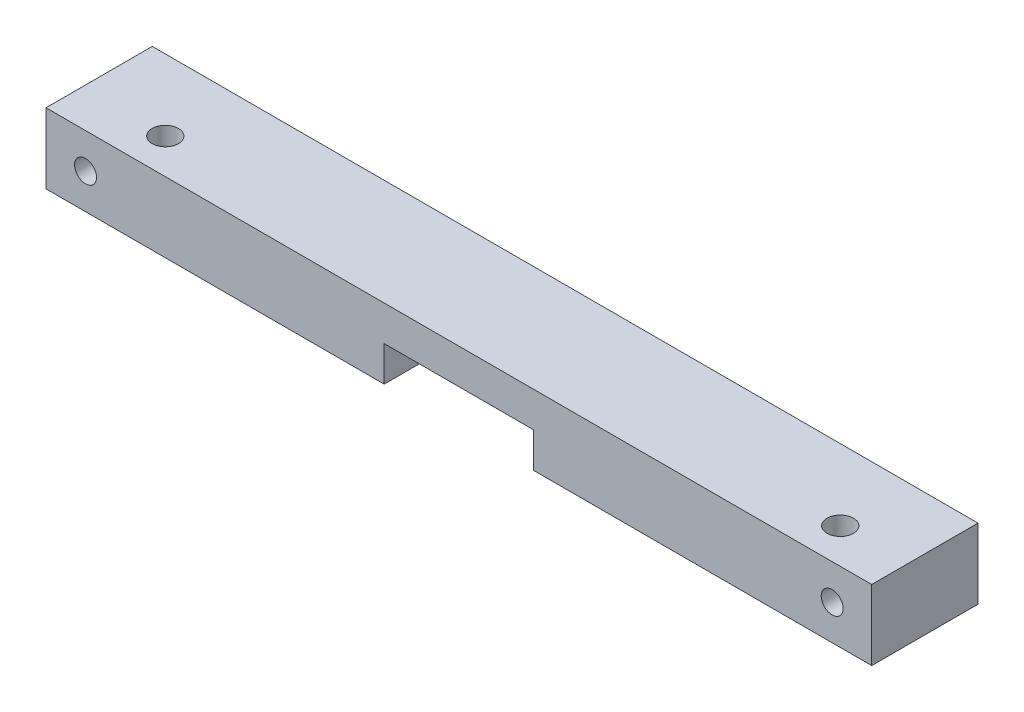
ISO-10303-21;
HEADER;
FILE_DESCRIPTION(('STEP AP214'),'2;1');
FILE_NAME('part.step','',(''),(''),'','','');
FILE_SCHEMA(('AUTOMOTIVE_DESIGN { 1 0 10303 214 1 1 1 1 }'));
ENDSEC;
DATA;
#1=APPLICATION_CONTEXT('core data for automotive mechanical design processes');
#2=APPLICATION_PROTOCOL_DEFINITION('international standard','automotive_design',2000,#1);
#3=PRODUCT_CONTEXT('',#1,'mechanical');
#4=PRODUCT('Part','Part','',(#3));
#5=PRODUCT_RELATED_PRODUCT_CATEGORY('part','',(#4));
#6=PRODUCT_DEFINITION_FORMATION('','',#4);
#7=PRODUCT_DEFINITION_CONTEXT('part definition',#1,'design');
#8=PRODUCT_DEFINITION('design','',#6,#7);
#9=PRODUCT_DEFINITION_SHAPE('','',#8);
#10=(LENGTH_UNIT() NAMED_UNIT(*) SI_UNIT(.MILLI.,.METRE.));
#11=(NAMED_UNIT(*) PLANE_ANGLE_UNIT() SI_UNIT($,.RADIAN.));
#12=(NAMED_UNIT(*) SI_UNIT($,.STERADIAN.) SOLID_ANGLE_UNIT());
#13=UNCERTAINTY_MEASURE_WITH_UNIT(LENGTH_MEASURE(1.E-05),#10,'distance_accuracy_value','');
#14=(GEOMETRIC_REPRESENTATION_CONTEXT(3) GLOBAL_UNCERTAINTY_ASSIGNED_CONTEXT((#13)) GLOBAL_UNIT_ASSIGNED_CONTEXT((#10,
#11,#12)) REPRESENTATION_CONTEXT('',''));
#15=CARTESIAN_POINT('',(0.,0.,0.));
#16=DIRECTION('',(0.,0.,1.));
#17=DIRECTION('',(1.,0.,0.));
#18=AXIS2_PLACEMENT_3D('',#15,#16,#17);
#19=CARTESIAN_POINT('',(298.45,0.,0.));
#20=DIRECTION('',(0.,1.,0.));
#21=DIRECTION('',(0.,0.,1.));
#22=AXIS2_PLACEMENT_3D('',#19,#20,#21);
#23=PLANE('',#22);
#24=CARTESIAN_POINT('',(30.4121566,0.,-12.7));
#25=DIRECTION('',(0.,1.,0.));
#26=DIRECTION('',(0.,0.,1.));
#27=AXIS2_PLACEMENT_3D('',#24,#25,#26);
#28=CIRCLE('',#27,4.7625);
#29=CARTESIAN_POINT('',(30.4121566,0.,-7.9375));
#30=VERTEX_POINT('',#29);
#31=EDGE_CURVE('E152',#30,#30,#28,.T.);
#32=ORIENTED_EDGE('',*,*,#31,.T.);
#33=EDGE_LOOP('',(#32));
#34=FACE_BOUND('',#33,.T.);
#35=DIRECTION('',(-1.,0.,0.));
#36=VECTOR('',#35,1.);
#37=CARTESIAN_POINT('',(298.45,0.,-38.421818));
#38=LINE('',#37,#36);
#39=CARTESIAN_POINT('',(122.2375,0.,-38.421818));
#40=VERTEX_POINT('',#39);
#41=CARTESIAN_POINT('',(0.,0.,-38.421818));
#42=VERTEX_POINT('',#41);
#43=EDGE_CURVE('E191',#40,#42,#38,.T.);
#44=ORIENTED_EDGE('',*,*,#43,.F.);
#45=DIRECTION('',(0.,0.,-1.));
#46=VECTOR('',#45,1.);
#47=CARTESIAN_POINT('',(122.2375,0.,0.));
#48=LINE('',#47,#46);
#49=CARTESIAN_POINT('',(122.2375,0.,0.));
#50=VERTEX_POINT('',#49);
#51=EDGE_CURVE('E118',#50,#40,#48,.T.);
#52=ORIENTED_EDGE('',*,*,#51,.F.);
#53=DIRECTION('',(-1.,0.,0.));
#54=VECTOR('',#53,1.);
#55=CARTESIAN_POINT('',(298.45,0.,0.));
#56=LINE('',#55,#54);
#57=CARTESIAN_POINT('',(0.,0.,0.));
#58=VERTEX_POINT('',#57);
#59=EDGE_CURVE('E47',#50,#58,#56,.T.);
#60=ORIENTED_EDGE('',*,*,#59,.T.);
#61=DIRECTION('',(0.,0.,-1.));
#62=VECTOR('',#61,1.);
#63=CARTESIAN_POINT('',(0.,0.,0.));
#64=LINE('',#63,#62);
#65=EDGE_CURVE('E183',#58,#42,#64,.T.);
#66=ORIENTED_EDGE('',*,*,#65,.T.);
#67=EDGE_LOOP('',(#44,#52,#60,#66));
#68=FACE_BOUND('',#67,.T.);
#69=ADVANCED_FACE('F39',(#34,#68),#23,.F.);
#70=CARTESIAN_POINT('',(298.45,0.,-38.421818));
#71=DIRECTION('',(0.,0.,1.));
#72=DIRECTION('',(1.,0.,0.));
#73=AXIS2_PLACEMENT_3D('',#70,#71,#72);
#74=PLANE('',#73);
#75=CARTESIAN_POINT('',(14.2875,12.7,-38.421818));
#76=DIRECTION('',(0.,0.,-1.));
#77=DIRECTION('',(-1.,0.,0.));
#78=AXIS2_PLACEMENT_3D('',#75,#76,#77);
#79=CIRCLE('',#78,3.96875);
#80=CARTESIAN_POINT('',(10.31875,12.7,-38.421818));
#81=VERTEX_POINT('',#80);
#82=EDGE_CURVE('E167',#81,#81,#79,.T.);
#83=ORIENTED_EDGE('',*,*,#82,.F.);
#84=EDGE_LOOP('',(#83));
#85=FACE_BOUND('',#84,.T.);
#86=DIRECTION('',(1.,0.,0.));
#87=VECTOR('',#86,1.);
#88=CARTESIAN_POINT('',(122.2375,12.7,-38.421818));
#89=LINE('',#88,#87);
#90=CARTESIAN_POINT('',(122.2375,12.7,-38.421818));
#91=VERTEX_POINT('',#90);
#92=CARTESIAN_POINT('',(176.2125,12.7,-38.421818));
#93=VERTEX_POINT('',#92);
#94=EDGE_CURVE('E128',#91,#93,#89,.T.);
#95=ORIENTED_EDGE('',*,*,#94,.F.);
#96=DIRECTION('',(0.,-1.,0.));
#97=VECTOR('',#96,1.);
#98=CARTESIAN_POINT('',(122.2375,12.7,-38.421818));
#99=LINE('',#98,#97);
#100=EDGE_CURVE('E112',#91,#40,#99,.T.);
#101=ORIENTED_EDGE('',*,*,#100,.T.);
#102=ORIENTED_EDGE('',*,*,#43,.T.);
#103=DIRECTION('',(0.,1.,0.));
#104=VECTOR('',#103,1.);
#105=CARTESIAN_POINT('',(0.,0.,-38.421818));
#106=LINE('',#105,#104);
#107=CARTESIAN_POINT('',(0.,25.4,-38.421818));
#108=VERTEX_POINT('',#107);
#109=EDGE_CURVE('E186',#42,#108,#106,.T.);
#110=ORIENTED_EDGE('',*,*,#109,.T.);
#111=DIRECTION('',(-1.,0.,0.));
#112=VECTOR('',#111,1.);
#113=CARTESIAN_POINT('',(298.45,25.4,-38.421818));
#114=LINE('',#113,#112);
#115=CARTESIAN_POINT('',(298.45,25.4,-38.421818));
#116=VERTEX_POINT('',#115);
#117=EDGE_CURVE('E190',#116,#108,#114,.T.);
#118=ORIENTED_EDGE('',*,*,#117,.F.);
#119=DIRECTION('',(0.,1.,0.));
#120=VECTOR('',#119,1.);
#121=CARTESIAN_POINT('',(298.45,0.,-38.421818));
#122=LINE('',#121,#120);
#123=CARTESIAN_POINT('',(298.45,0.,-38.421818));
#124=VERTEX_POINT('',#123);
#125=EDGE_CURVE('E177',#124,#116,#122,.T.);
#126=ORIENTED_EDGE('',*,*,#125,.F.);
#127=CARTESIAN_POINT('',(176.2125,0.,-38.421818));
#128=VERTEX_POINT('',#127);
#129=EDGE_CURVE('E192',#124,#128,#38,.T.);
#130=ORIENTED_EDGE('',*,*,#129,.T.);
#131=DIRECTION('',(0.,-1.,0.));
#132=VECTOR('',#131,1.);
#133=CARTESIAN_POINT('',(176.2125,12.7,-38.421818));
#134=LINE('',#133,#132);
#135=EDGE_CURVE('E54',#93,#128,#134,.T.);
#136=ORIENTED_EDGE('',*,*,#135,.F.);
#137=EDGE_LOOP('',(#95,#101,#102,#110,#118,#126,#130,#136));
#138=FACE_BOUND('',#137,.T.);
#139=CARTESIAN_POINT('',(284.1625,12.7,-38.421818));
#140=DIRECTION('',(0.,0.,-1.));
#141=DIRECTION('',(-1.,0.,0.));
#142=AXIS2_PLACEMENT_3D('',#139,#140,#141);
#143=CIRCLE('',#142,3.96875000000002);
#144=CARTESIAN_POINT('',(280.19375,12.7,-38.421818));
#145=VERTEX_POINT('',#144);
#146=EDGE_CURVE('E161',#145,#145,#143,.T.);
#147=ORIENTED_EDGE('',*,*,#146,.F.);
#148=EDGE_LOOP('',(#147));
#149=FACE_BOUND('',#148,.T.);
#150=ADVANCED_FACE('F133',(#85,#138,#149),#74,.F.);
#151=CARTESIAN_POINT('',(298.45,0.,0.));
#152=DIRECTION('',(0.,0.,-1.));
#153=DIRECTION('',(-1.,0.,0.));
#154=AXIS2_PLACEMENT_3D('',#151,#152,#153);
#155=PLANE('',#154);
#156=ORIENTED_EDGE('',*,*,#59,.F.);
#157=DIRECTION('',(0.,-1.,0.));
#158=VECTOR('',#157,1.);
#159=CARTESIAN_POINT('',(122.2375,12.7,0.));
#160=LINE('',#159,#158);
#161=CARTESIAN_POINT('',(122.2375,12.7,0.));
#162=VERTEX_POINT('',#161);
#163=EDGE_CURVE('E143',#162,#50,#160,.T.);
#164=ORIENTED_EDGE('',*,*,#163,.F.);
#165=DIRECTION('',(-1.,0.,0.));
#166=VECTOR('',#165,1.);
#167=CARTESIAN_POINT('',(122.2375,12.7,0.));
#168=LINE('',#167,#166);
#169=CARTESIAN_POINT('',(176.2125,12.7,0.));
#170=VERTEX_POINT('',#169);
#171=EDGE_CURVE('E122',#170,#162,#168,.T.);
#172=ORIENTED_EDGE('',*,*,#171,.F.);
#173=DIRECTION('',(0.,-1.,0.));
#174=VECTOR('',#173,1.);
#175=CARTESIAN_POINT('',(176.2125,12.7,0.));
#176=LINE('',#175,#174);
#177=CARTESIAN_POINT('',(176.2125,0.,0.));
#178=VERTEX_POINT('',#177);
#179=EDGE_CURVE('E146',#170,#178,#176,.T.);
#180=ORIENTED_EDGE('',*,*,#179,.T.);
#181=CARTESIAN_POINT('',(298.45,0.,0.));
#182=VERTEX_POINT('',#181);
#183=EDGE_CURVE('E11',#182,#178,#56,.T.);
#184=ORIENTED_EDGE('',*,*,#183,.F.);
#185=DIRECTION('',(0.,-1.,0.));
#186=VECTOR('',#185,1.);
#187=CARTESIAN_POINT('',(298.45,0.,0.));
#188=LINE('',#187,#186);
#189=CARTESIAN_POINT('',(298.45,25.4,0.));
#190=VERTEX_POINT('',#189);
#191=EDGE_CURVE('E174',#190,#182,#188,.T.);
#192=ORIENTED_EDGE('',*,*,#191,.F.);
#193=DIRECTION('',(-1.,0.,0.));
#194=VECTOR('',#193,1.);
#195=CARTESIAN_POINT('',(298.45,25.4,0.));
#196=LINE('',#195,#194);
#197=CARTESIAN_POINT('',(0.,25.4,0.));
#198=VERTEX_POINT('',#197);
#199=EDGE_CURVE('E180',#190,#198,#196,.T.);
#200=ORIENTED_EDGE('',*,*,#199,.T.);
#201=DIRECTION('',(0.,-1.,0.));
#202=VECTOR('',#201,1.);
#203=CARTESIAN_POINT('',(0.,0.,0.));
#204=LINE('',#203,#202);
#205=EDGE_CURVE('E173',#198,#58,#204,.T.);
#206=ORIENTED_EDGE('',*,*,#205,.T.);
#207=EDGE_LOOP('',(#156,#164,#172,#180,#184,#192,#200,#206));
#208=FACE_BOUND('',#207,.T.);
#209=CARTESIAN_POINT('',(284.1625,12.7,0.));
#210=DIRECTION('',(0.,0.,-1.));
#211=DIRECTION('',(-1.,0.,0.));
#212=AXIS2_PLACEMENT_3D('',#209,#210,#211);
#213=CIRCLE('',#212,3.96874999999997);
#214=CARTESIAN_POINT('',(280.19375,12.7,0.));
#215=VERTEX_POINT('',#214);
#216=EDGE_CURVE('E164',#215,#215,#213,.T.);
#217=ORIENTED_EDGE('',*,*,#216,.T.);
#218=EDGE_LOOP('',(#217));
#219=FACE_BOUND('',#218,.T.);
#220=CARTESIAN_POINT('',(14.2875,12.7,0.));
#221=DIRECTION('',(0.,0.,-1.));
#222=DIRECTION('',(-1.,0.,0.));
#223=AXIS2_PLACEMENT_3D('',#220,#221,#222);
#224=CIRCLE('',#223,3.96874999999999);
#225=CARTESIAN_POINT('',(10.31875,12.7,0.));
#226=VERTEX_POINT('',#225);
#227=EDGE_CURVE('E170',#226,#226,#224,.T.);
#228=ORIENTED_EDGE('',*,*,#227,.T.);
#229=EDGE_LOOP('',(#228));
#230=FACE_BOUND('',#229,.T.);
#231=ADVANCED_FACE('F41',(#208,#219,#230),#155,.F.);
#232=CARTESIAN_POINT('',(274.3878434,0.,-12.7));
#233=DIRECTION('',(0.,1.,0.));
#234=DIRECTION('',(0.,0.,1.));
#235=AXIS2_PLACEMENT_3D('',#232,#233,#234);
#236=CIRCLE('',#235,4.7625);
#237=CARTESIAN_POINT('',(274.3878434,0.,-7.9375));
#238=VERTEX_POINT('',#237);
#239=EDGE_CURVE('E158',#238,#238,#236,.T.);
#240=ORIENTED_EDGE('',*,*,#239,.T.);
#241=EDGE_LOOP('',(#240));
#242=FACE_BOUND('',#241,.T.);
#243=ORIENTED_EDGE('',*,*,#183,.T.);
#244=DIRECTION('',(0.,0.,1.));
#245=VECTOR('',#244,1.);
#246=CARTESIAN_POINT('',(176.2125,0.,0.));
#247=LINE('',#246,#245);
#248=EDGE_CURVE('E131',#128,#178,#247,.T.);
#249=ORIENTED_EDGE('',*,*,#248,.F.);
#250=ORIENTED_EDGE('',*,*,#129,.F.);
#251=DIRECTION('',(0.,0.,-1.));
#252=VECTOR('',#251,1.);
#253=CARTESIAN_POINT('',(298.45,0.,0.));
#254=LINE('',#253,#252);
#255=EDGE_CURVE('E91',#182,#124,#254,.T.);
#256=ORIENTED_EDGE('',*,*,#255,.F.);
#257=EDGE_LOOP('',(#243,#249,#250,#256));
#258=FACE_BOUND('',#257,.T.);
#259=ADVANCED_FACE('F208',(#242,#258),#23,.F.);
#260=CARTESIAN_POINT('',(298.45,25.4,0.));
#261=DIRECTION('',(0.,-1.,0.));
#262=DIRECTION('',(0.,0.,-1.));
#263=AXIS2_PLACEMENT_3D('',#260,#261,#262);
#264=PLANE('',#263);
#265=CARTESIAN_POINT('',(30.4121566,25.4,-12.7));
#266=DIRECTION('',(0.,1.,0.));
#267=DIRECTION('',(0.,0.,1.));
#268=AXIS2_PLACEMENT_3D('',#265,#266,#267);
#269=CIRCLE('',#268,4.76249999999999);
#270=CARTESIAN_POINT('',(30.4121566,25.4,-7.93750000000001));
#271=VERTEX_POINT('',#270);
#272=EDGE_CURVE('E145',#271,#271,#269,.T.);
#273=ORIENTED_EDGE('',*,*,#272,.F.);
#274=EDGE_LOOP('',(#273));
#275=FACE_BOUND('',#274,.T.);
#276=CARTESIAN_POINT('',(274.3878434,25.4,-12.7));
#277=DIRECTION('',(0.,1.,0.));
#278=DIRECTION('',(0.,0.,1.));
#279=AXIS2_PLACEMENT_3D('',#276,#277,#278);
#280=CIRCLE('',#279,4.7625);
#281=CARTESIAN_POINT('',(274.3878434,25.4,-7.9375));
#282=VERTEX_POINT('',#281);
#283=EDGE_CURVE('E155',#282,#282,#280,.T.);
#284=ORIENTED_EDGE('',*,*,#283,.F.);
#285=EDGE_LOOP('',(#284));
#286=FACE_BOUND('',#285,.T.);
#287=DIRECTION('',(0.,0.,1.));
#288=VECTOR('',#287,1.);
#289=CARTESIAN_POINT('',(0.,25.4,0.));
#290=LINE('',#289,#288);
#291=EDGE_CURVE('E84',#108,#198,#290,.T.);
#292=ORIENTED_EDGE('',*,*,#291,.T.);
#293=ORIENTED_EDGE('',*,*,#199,.F.);
#294=DIRECTION('',(0.,0.,1.));
#295=VECTOR('',#294,1.);
#296=CARTESIAN_POINT('',(298.45,25.4,0.));
#297=LINE('',#296,#295);
#298=EDGE_CURVE('E63',#116,#190,#297,.T.);
#299=ORIENTED_EDGE('',*,*,#298,.F.);
#300=ORIENTED_EDGE('',*,*,#117,.T.);
#301=EDGE_LOOP('',(#292,#293,#299,#300));
#302=FACE_BOUND('',#301,.T.);
#303=ADVANCED_FACE('F206',(#275,#286,#302),#264,.F.);
#304=CARTESIAN_POINT('',(298.45,0.,0.));
#305=DIRECTION('',(-1.,0.,0.));
#306=DIRECTION('',(0.,0.,1.));
#307=AXIS2_PLACEMENT_3D('',#304,#305,#306);
#308=PLANE('',#307);
#309=ORIENTED_EDGE('',*,*,#191,.T.);
#310=ORIENTED_EDGE('',*,*,#255,.T.);
#311=ORIENTED_EDGE('',*,*,#125,.T.);
#312=ORIENTED_EDGE('',*,*,#298,.T.);
#313=EDGE_LOOP('',(#309,#310,#311,#312));
#314=FACE_BOUND('',#313,.T.);
#315=ADVANCED_FACE('F207',(#314),#308,.F.);
#316=CARTESIAN_POINT('',(0.,0.,0.));
#317=DIRECTION('',(-1.,0.,0.));
#318=DIRECTION('',(0.,0.,1.));
#319=AXIS2_PLACEMENT_3D('',#316,#317,#318);
#320=PLANE('',#319);
#321=ORIENTED_EDGE('',*,*,#205,.F.);
#322=ORIENTED_EDGE('',*,*,#291,.F.);
#323=ORIENTED_EDGE('',*,*,#109,.F.);
#324=ORIENTED_EDGE('',*,*,#65,.F.);
#325=EDGE_LOOP('',(#321,#322,#323,#324));
#326=FACE_BOUND('',#325,.T.);
#327=ADVANCED_FACE('F201',(#326),#320,.T.);
#328=CARTESIAN_POINT('',(14.2875,12.7,-38.421818));
#329=DIRECTION('',(0.,0.,-1.));
#330=DIRECTION('',(-1.,0.,0.));
#331=AXIS2_PLACEMENT_3D('',#328,#329,#330);
#332=CYLINDRICAL_SURFACE('',#331,3.96874999999999);
#333=ORIENTED_EDGE('',*,*,#227,.F.);
#334=EDGE_LOOP('',(#333));
#335=FACE_BOUND('',#334,.T.);
#336=ORIENTED_EDGE('',*,*,#82,.T.);
#337=EDGE_LOOP('',(#336));
#338=FACE_BOUND('',#337,.T.);
#339=ADVANCED_FACE('F249',(#335,#338),#332,.F.);
#340=CARTESIAN_POINT('',(284.1625,12.7,-38.421818));
#341=DIRECTION('',(0.,0.,-1.));
#342=DIRECTION('',(-1.,0.,0.));
#343=AXIS2_PLACEMENT_3D('',#340,#341,#342);
#344=CYLINDRICAL_SURFACE('',#343,3.96874999999999);
#345=ORIENTED_EDGE('',*,*,#216,.F.);
#346=EDGE_LOOP('',(#345));
#347=FACE_BOUND('',#346,.T.);
#348=ORIENTED_EDGE('',*,*,#146,.T.);
#349=EDGE_LOOP('',(#348));
#350=FACE_BOUND('',#349,.T.);
#351=ADVANCED_FACE('F240',(#347,#350),#344,.F.);
#352=CARTESIAN_POINT('',(274.3878434,25.4,-12.7));
#353=DIRECTION('',(0.,1.,0.));
#354=DIRECTION('',(0.,0.,1.));
#355=AXIS2_PLACEMENT_3D('',#352,#353,#354);
#356=CYLINDRICAL_SURFACE('',#355,4.7625);
#357=ORIENTED_EDGE('',*,*,#239,.F.);
#358=EDGE_LOOP('',(#357));
#359=FACE_BOUND('',#358,.T.);
#360=ORIENTED_EDGE('',*,*,#283,.T.);
#361=EDGE_LOOP('',(#360));
#362=FACE_BOUND('',#361,.T.);
#363=ADVANCED_FACE('F237',(#359,#362),#356,.F.);
#364=CARTESIAN_POINT('',(30.4121566,25.4,-12.7));
#365=DIRECTION('',(0.,1.,0.));
#366=DIRECTION('',(0.,0.,1.));
#367=AXIS2_PLACEMENT_3D('',#364,#365,#366);
#368=CYLINDRICAL_SURFACE('',#367,4.76249999999999);
#369=ORIENTED_EDGE('',*,*,#31,.F.);
#370=EDGE_LOOP('',(#369));
#371=FACE_BOUND('',#370,.T.);
#372=ORIENTED_EDGE('',*,*,#272,.T.);
#373=EDGE_LOOP('',(#372));
#374=FACE_BOUND('',#373,.T.);
#375=ADVANCED_FACE('F217',(#371,#374),#368,.F.);
#376=CARTESIAN_POINT('',(122.2375,12.7,0.));
#377=DIRECTION('',(-1.,0.,0.));
#378=DIRECTION('',(0.,0.,1.));
#379=AXIS2_PLACEMENT_3D('',#376,#377,#378);
#380=PLANE('',#379);
#381=ORIENTED_EDGE('',*,*,#51,.T.);
#382=ORIENTED_EDGE('',*,*,#100,.F.);
#383=DIRECTION('',(0.,0.,-1.));
#384=VECTOR('',#383,1.);
#385=CARTESIAN_POINT('',(122.2375,12.7,0.));
#386=LINE('',#385,#384);
#387=EDGE_CURVE('E115',#162,#91,#386,.T.);
#388=ORIENTED_EDGE('',*,*,#387,.F.);
#389=ORIENTED_EDGE('',*,*,#163,.T.);
#390=EDGE_LOOP('',(#381,#382,#388,#389));
#391=FACE_BOUND('',#390,.T.);
#392=ADVANCED_FACE('F114',(#391),#380,.F.);
#393=CARTESIAN_POINT('',(176.2125,12.7,0.));
#394=DIRECTION('',(1.,0.,0.));
#395=DIRECTION('',(0.,0.,-1.));
#396=AXIS2_PLACEMENT_3D('',#393,#394,#395);
#397=PLANE('',#396);
#398=ORIENTED_EDGE('',*,*,#248,.T.);
#399=ORIENTED_EDGE('',*,*,#179,.F.);
#400=DIRECTION('',(0.,0.,1.));
#401=VECTOR('',#400,1.);
#402=CARTESIAN_POINT('',(176.2125,12.7,0.));
#403=LINE('',#402,#401);
#404=EDGE_CURVE('E136',#93,#170,#403,.T.);
#405=ORIENTED_EDGE('',*,*,#404,.F.);
#406=ORIENTED_EDGE('',*,*,#135,.T.);
#407=EDGE_LOOP('',(#398,#399,#405,#406));
#408=FACE_BOUND('',#407,.T.);
#409=ADVANCED_FACE('F209',(#408),#397,.F.);
#410=CARTESIAN_POINT('',(0.,12.7,0.));
#411=DIRECTION('',(0.,-1.,0.));
#412=DIRECTION('',(0.,0.,-1.));
#413=AXIS2_PLACEMENT_3D('',#410,#411,#412);
#414=PLANE('',#413);
#415=ORIENTED_EDGE('',*,*,#387,.T.);
#416=ORIENTED_EDGE('',*,*,#94,.T.);
#417=ORIENTED_EDGE('',*,*,#404,.T.);
#418=ORIENTED_EDGE('',*,*,#171,.T.);
#419=EDGE_LOOP('',(#415,#416,#417,#418));
#420=FACE_BOUND('',#419,.T.);
#421=ADVANCED_FACE('F126',(#420),#414,.T.);
#422=CLOSED_SHELL('',(#69,#150,#231,#259,#303,#315,#327,#339,#351,#363,#375,#392,#409,#421));
#423=MANIFOLD_SOLID_BREP('B2',#422);
#424=ADVANCED_BREP_SHAPE_REPRESENTATION('',(#18,#423),#14);
#425=SHAPE_DEFINITION_REPRESENTATION(#9,#424);
ENDSEC;
END-ISO-10303-21;
